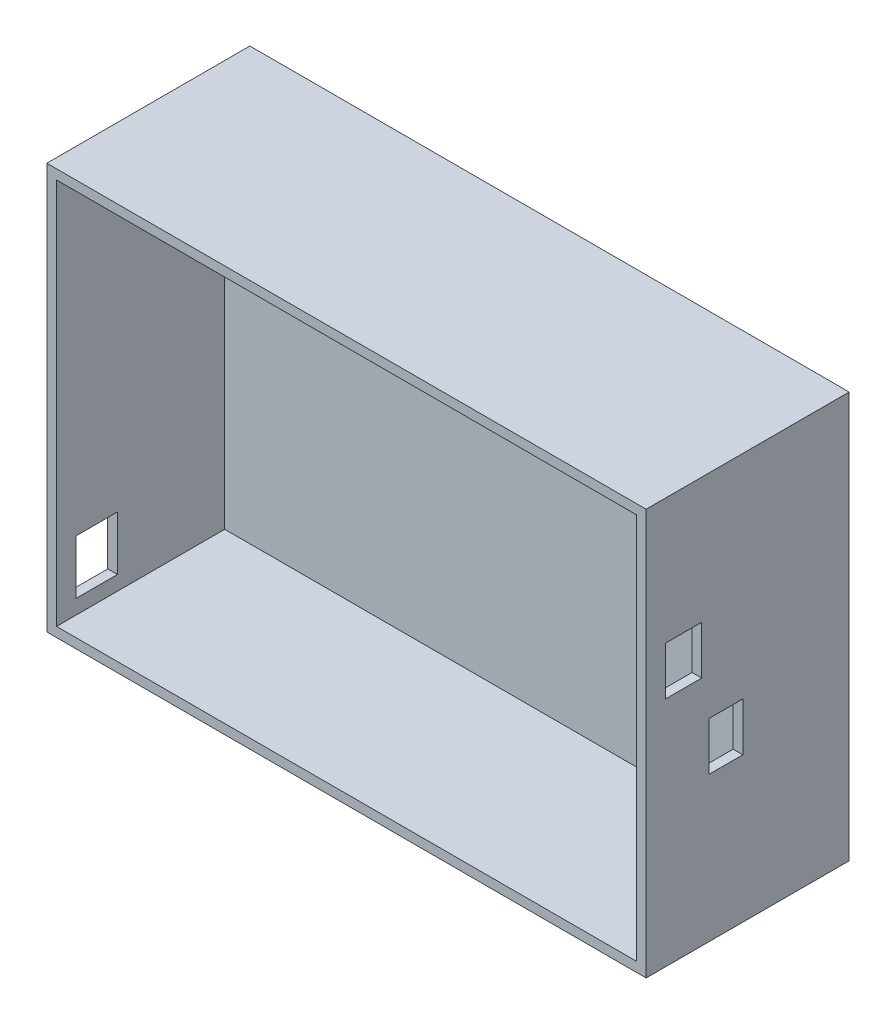
ISO-10303-21;
HEADER;
FILE_DESCRIPTION(('STEP AP214'),'2;1');
FILE_NAME('part.step','',(''),(''),'','','');
FILE_SCHEMA(('AUTOMOTIVE_DESIGN { 1 0 10303 214 1 1 1 1 }'));
ENDSEC;
DATA;
#1=APPLICATION_CONTEXT('core data for automotive mechanical design processes');
#2=APPLICATION_PROTOCOL_DEFINITION('international standard','automotive_design',2000,#1);
#3=PRODUCT_CONTEXT('',#1,'mechanical');
#4=PRODUCT('Part','Part','',(#3));
#5=PRODUCT_RELATED_PRODUCT_CATEGORY('part','',(#4));
#6=PRODUCT_DEFINITION_FORMATION('','',#4);
#7=PRODUCT_DEFINITION_CONTEXT('part definition',#1,'design');
#8=PRODUCT_DEFINITION('design','',#6,#7);
#9=PRODUCT_DEFINITION_SHAPE('','',#8);
#10=(LENGTH_UNIT() NAMED_UNIT(*) SI_UNIT(.MILLI.,.METRE.));
#11=(NAMED_UNIT(*) PLANE_ANGLE_UNIT() SI_UNIT($,.RADIAN.));
#12=(NAMED_UNIT(*) SI_UNIT($,.STERADIAN.) SOLID_ANGLE_UNIT());
#13=UNCERTAINTY_MEASURE_WITH_UNIT(LENGTH_MEASURE(1.E-05),#10,'distance_accuracy_value','');
#14=(GEOMETRIC_REPRESENTATION_CONTEXT(3) GLOBAL_UNCERTAINTY_ASSIGNED_CONTEXT((#13)) GLOBAL_UNIT_ASSIGNED_CONTEXT((#10,
#11,#12)) REPRESENTATION_CONTEXT('',''));
#15=CARTESIAN_POINT('',(0.,0.,0.));
#16=DIRECTION('',(0.,0.,1.));
#17=DIRECTION('',(1.,0.,0.));
#18=AXIS2_PLACEMENT_3D('',#15,#16,#17);
#19=CARTESIAN_POINT('',(78.74,-53.34,53.34));
#20=DIRECTION('',(-1.,0.,0.));
#21=DIRECTION('',(0.,0.,1.));
#22=AXIS2_PLACEMENT_3D('',#19,#20,#21);
#23=PLANE('',#22);
#24=DIRECTION('',(0.,0.,1.));
#25=VECTOR('',#24,1.);
#26=CARTESIAN_POINT('',(78.74,20.32,48.26));
#27=LINE('',#26,#25);
#28=CARTESIAN_POINT('',(78.74,20.32,38.735));
#29=VERTEX_POINT('',#28);
#30=CARTESIAN_POINT('',(78.74,20.32,48.26));
#31=VERTEX_POINT('',#30);
#32=EDGE_CURVE('E189',#29,#31,#27,.T.);
#33=ORIENTED_EDGE('',*,*,#32,.F.);
#34=DIRECTION('',(0.,1.,0.));
#35=VECTOR('',#34,1.);
#36=CARTESIAN_POINT('',(78.74,7.61999999999999,38.735));
#37=LINE('',#36,#35);
#38=CARTESIAN_POINT('',(78.74,7.61999999999999,38.735));
#39=VERTEX_POINT('',#38);
#40=EDGE_CURVE('E55',#39,#29,#37,.T.);
#41=ORIENTED_EDGE('',*,*,#40,.F.);
#42=DIRECTION('',(0.,0.,-1.));
#43=VECTOR('',#42,1.);
#44=CARTESIAN_POINT('',(78.74,7.61999999999999,48.26));
#45=LINE('',#44,#43);
#46=CARTESIAN_POINT('',(78.74,7.61999999999999,48.26));
#47=VERTEX_POINT('',#46);
#48=EDGE_CURVE('E195',#47,#39,#45,.T.);
#49=ORIENTED_EDGE('',*,*,#48,.F.);
#50=DIRECTION('',(0.,-1.,0.));
#51=VECTOR('',#50,1.);
#52=CARTESIAN_POINT('',(78.74,7.61999999999999,48.26));
#53=LINE('',#52,#51);
#54=EDGE_CURVE('E180',#31,#47,#53,.T.);
#55=ORIENTED_EDGE('',*,*,#54,.F.);
#56=EDGE_LOOP('',(#33,#41,#49,#55));
#57=FACE_BOUND('',#56,.T.);
#58=DIRECTION('',(0.,0.,1.));
#59=VECTOR('',#58,1.);
#60=CARTESIAN_POINT('',(78.74,-2.54,36.83));
#61=LINE('',#60,#59);
#62=CARTESIAN_POINT('',(78.74,-2.54000000000001,27.94));
#63=VERTEX_POINT('',#62);
#64=CARTESIAN_POINT('',(78.74,-2.54,36.83));
#65=VERTEX_POINT('',#64);
#66=EDGE_CURVE('E226',#63,#65,#61,.T.);
#67=ORIENTED_EDGE('',*,*,#66,.F.);
#68=DIRECTION('',(0.,1.,0.));
#69=VECTOR('',#68,1.);
#70=CARTESIAN_POINT('',(78.74,-15.24,27.94));
#71=LINE('',#70,#69);
#72=CARTESIAN_POINT('',(78.74,-15.24,27.94));
#73=VERTEX_POINT('',#72);
#74=EDGE_CURVE('E218',#73,#63,#71,.T.);
#75=ORIENTED_EDGE('',*,*,#74,.F.);
#76=DIRECTION('',(0.,0.,-1.));
#77=VECTOR('',#76,1.);
#78=CARTESIAN_POINT('',(78.74,-15.24,36.83));
#79=LINE('',#78,#77);
#80=CARTESIAN_POINT('',(78.74,-15.24,36.83));
#81=VERTEX_POINT('',#80);
#82=EDGE_CURVE('E232',#81,#73,#79,.T.);
#83=ORIENTED_EDGE('',*,*,#82,.F.);
#84=DIRECTION('',(0.,-1.,0.));
#85=VECTOR('',#84,1.);
#86=CARTESIAN_POINT('',(78.74,-15.24,36.83));
#87=LINE('',#86,#85);
#88=EDGE_CURVE('E229',#65,#81,#87,.T.);
#89=ORIENTED_EDGE('',*,*,#88,.F.);
#90=EDGE_LOOP('',(#67,#75,#83,#89));
#91=FACE_BOUND('',#90,.T.);
#92=DIRECTION('',(0.,1.,0.));
#93=VECTOR('',#92,1.);
#94=CARTESIAN_POINT('',(78.74,-53.34,0.));
#95=LINE('',#94,#93);
#96=CARTESIAN_POINT('',(78.74,-53.34,0.));
#97=VERTEX_POINT('',#96);
#98=CARTESIAN_POINT('',(78.74,53.34,0.));
#99=VERTEX_POINT('',#98);
#100=EDGE_CURVE('E270',#97,#99,#95,.T.);
#101=ORIENTED_EDGE('',*,*,#100,.T.);
#102=DIRECTION('',(0.,0.,-1.));
#103=VECTOR('',#102,1.);
#104=CARTESIAN_POINT('',(78.74,53.34,53.34));
#105=LINE('',#104,#103);
#106=CARTESIAN_POINT('',(78.74,53.34,53.34));
#107=VERTEX_POINT('',#106);
#108=EDGE_CURVE('E303',#107,#99,#105,.T.);
#109=ORIENTED_EDGE('',*,*,#108,.F.);
#110=DIRECTION('',(0.,1.,0.));
#111=VECTOR('',#110,1.);
#112=CARTESIAN_POINT('',(78.74,-53.34,53.34));
#113=LINE('',#112,#111);
#114=CARTESIAN_POINT('',(78.74,-53.34,53.34));
#115=VERTEX_POINT('',#114);
#116=EDGE_CURVE('E277',#115,#107,#113,.T.);
#117=ORIENTED_EDGE('',*,*,#116,.F.);
#118=DIRECTION('',(0.,0.,-1.));
#119=VECTOR('',#118,1.);
#120=CARTESIAN_POINT('',(78.74,-53.34,53.34));
#121=LINE('',#120,#119);
#122=EDGE_CURVE('E287',#115,#97,#121,.T.);
#123=ORIENTED_EDGE('',*,*,#122,.T.);
#124=EDGE_LOOP('',(#101,#109,#117,#123));
#125=FACE_BOUND('',#124,.T.);
#126=ADVANCED_FACE('F41',(#57,#91,#125),#23,.F.);
#127=CARTESIAN_POINT('',(-78.74,53.34,53.34));
#128=DIRECTION('',(0.,-1.,0.));
#129=DIRECTION('',(0.,0.,-1.));
#130=AXIS2_PLACEMENT_3D('',#127,#128,#129);
#131=PLANE('',#130);
#132=DIRECTION('',(-1.,0.,0.));
#133=VECTOR('',#132,1.);
#134=CARTESIAN_POINT('',(-78.74,53.34,0.));
#135=LINE('',#134,#133);
#136=CARTESIAN_POINT('',(-78.74,53.34,0.));
#137=VERTEX_POINT('',#136);
#138=EDGE_CURVE('E290',#99,#137,#135,.T.);
#139=ORIENTED_EDGE('',*,*,#138,.T.);
#140=DIRECTION('',(0.,0.,-1.));
#141=VECTOR('',#140,1.);
#142=CARTESIAN_POINT('',(-78.74,53.34,53.34));
#143=LINE('',#142,#141);
#144=CARTESIAN_POINT('',(-78.74,53.34,53.34));
#145=VERTEX_POINT('',#144);
#146=EDGE_CURVE('E300',#145,#137,#143,.T.);
#147=ORIENTED_EDGE('',*,*,#146,.F.);
#148=DIRECTION('',(-1.,0.,0.));
#149=VECTOR('',#148,1.);
#150=CARTESIAN_POINT('',(-78.74,53.34,53.34));
#151=LINE('',#150,#149);
#152=EDGE_CURVE('E280',#107,#145,#151,.T.);
#153=ORIENTED_EDGE('',*,*,#152,.F.);
#154=ORIENTED_EDGE('',*,*,#108,.T.);
#155=EDGE_LOOP('',(#139,#147,#153,#154));
#156=FACE_BOUND('',#155,.T.);
#157=ADVANCED_FACE('F354',(#156),#131,.F.);
#158=CARTESIAN_POINT('',(-78.74,-53.34,53.34));
#159=DIRECTION('',(1.,0.,0.));
#160=DIRECTION('',(0.,0.,-1.));
#161=AXIS2_PLACEMENT_3D('',#158,#159,#160);
#162=PLANE('',#161);
#163=DIRECTION('',(0.,0.,-1.));
#164=VECTOR('',#163,1.);
#165=CARTESIAN_POINT('',(-78.74,-32.766,37.338));
#166=LINE('',#165,#164);
#167=CARTESIAN_POINT('',(-78.74,-32.766,48.26));
#168=VERTEX_POINT('',#167);
#169=CARTESIAN_POINT('',(-78.74,-32.766,37.338));
#170=VERTEX_POINT('',#169);
#171=EDGE_CURVE('E206',#168,#170,#166,.T.);
#172=ORIENTED_EDGE('',*,*,#171,.F.);
#173=DIRECTION('',(0.,1.,0.));
#174=VECTOR('',#173,1.);
#175=CARTESIAN_POINT('',(-78.74,-32.766,48.26));
#176=LINE('',#175,#174);
#177=CARTESIAN_POINT('',(-78.74,-46.99,48.26));
#178=VERTEX_POINT('',#177);
#179=EDGE_CURVE('E202',#178,#168,#176,.T.);
#180=ORIENTED_EDGE('',*,*,#179,.F.);
#181=DIRECTION('',(0.,0.,1.));
#182=VECTOR('',#181,1.);
#183=CARTESIAN_POINT('',(-78.74,-46.99,37.338));
#184=LINE('',#183,#182);
#185=CARTESIAN_POINT('',(-78.74,-46.99,37.338));
#186=VERTEX_POINT('',#185);
#187=EDGE_CURVE('E212',#186,#178,#184,.T.);
#188=ORIENTED_EDGE('',*,*,#187,.F.);
#189=DIRECTION('',(0.,-1.,0.));
#190=VECTOR('',#189,1.);
#191=CARTESIAN_POINT('',(-78.74,-32.766,37.338));
#192=LINE('',#191,#190);
#193=EDGE_CURVE('E209',#170,#186,#192,.T.);
#194=ORIENTED_EDGE('',*,*,#193,.F.);
#195=EDGE_LOOP('',(#172,#180,#188,#194));
#196=FACE_BOUND('',#195,.T.);
#197=DIRECTION('',(0.,-1.,0.));
#198=VECTOR('',#197,1.);
#199=CARTESIAN_POINT('',(-78.74,-53.34,0.));
#200=LINE('',#199,#198);
#201=CARTESIAN_POINT('',(-78.74,-53.34,0.));
#202=VERTEX_POINT('',#201);
#203=EDGE_CURVE('E292',#137,#202,#200,.T.);
#204=ORIENTED_EDGE('',*,*,#203,.T.);
#205=DIRECTION('',(0.,0.,-1.));
#206=VECTOR('',#205,1.);
#207=CARTESIAN_POINT('',(-78.74,-53.34,53.34));
#208=LINE('',#207,#206);
#209=CARTESIAN_POINT('',(-78.74,-53.34,53.34));
#210=VERTEX_POINT('',#209);
#211=EDGE_CURVE('E297',#210,#202,#208,.T.);
#212=ORIENTED_EDGE('',*,*,#211,.F.);
#213=DIRECTION('',(0.,-1.,0.));
#214=VECTOR('',#213,1.);
#215=CARTESIAN_POINT('',(-78.74,-53.34,53.34));
#216=LINE('',#215,#214);
#217=EDGE_CURVE('E283',#145,#210,#216,.T.);
#218=ORIENTED_EDGE('',*,*,#217,.F.);
#219=ORIENTED_EDGE('',*,*,#146,.T.);
#220=EDGE_LOOP('',(#204,#212,#218,#219));
#221=FACE_BOUND('',#220,.T.);
#222=ADVANCED_FACE('F358',(#196,#221),#162,.F.);
#223=CARTESIAN_POINT('',(-78.74,-53.34,53.34));
#224=DIRECTION('',(0.,1.,0.));
#225=DIRECTION('',(0.,0.,1.));
#226=AXIS2_PLACEMENT_3D('',#223,#224,#225);
#227=PLANE('',#226);
#228=DIRECTION('',(1.,0.,0.));
#229=VECTOR('',#228,1.);
#230=CARTESIAN_POINT('',(-78.74,-53.34,0.));
#231=LINE('',#230,#229);
#232=EDGE_CURVE('E281',#202,#97,#231,.T.);
#233=ORIENTED_EDGE('',*,*,#232,.T.);
#234=ORIENTED_EDGE('',*,*,#122,.F.);
#235=DIRECTION('',(1.,0.,0.));
#236=VECTOR('',#235,1.);
#237=CARTESIAN_POINT('',(-78.74,-53.34,53.34));
#238=LINE('',#237,#236);
#239=EDGE_CURVE('E285',#210,#115,#238,.T.);
#240=ORIENTED_EDGE('',*,*,#239,.F.);
#241=ORIENTED_EDGE('',*,*,#211,.T.);
#242=EDGE_LOOP('',(#233,#234,#240,#241));
#243=FACE_BOUND('',#242,.T.);
#244=ADVANCED_FACE('F363',(#243),#227,.F.);
#245=CARTESIAN_POINT('',(0.,0.,53.34));
#246=DIRECTION('',(0.,0.,-1.));
#247=DIRECTION('',(-1.,0.,0.));
#248=AXIS2_PLACEMENT_3D('',#245,#246,#247);
#249=PLANE('',#248);
#250=DIRECTION('',(-1.,0.,0.));
#251=VECTOR('',#250,1.);
#252=CARTESIAN_POINT('',(-76.1999999999999,50.8,53.34));
#253=LINE('',#252,#251);
#254=CARTESIAN_POINT('',(76.2000000000001,50.8,53.34));
#255=VERTEX_POINT('',#254);
#256=CARTESIAN_POINT('',(-76.1999999999999,50.8,53.34));
#257=VERTEX_POINT('',#256);
#258=EDGE_CURVE('E260',#255,#257,#253,.T.);
#259=ORIENTED_EDGE('',*,*,#258,.F.);
#260=DIRECTION('',(0.,1.,0.));
#261=VECTOR('',#260,1.);
#262=CARTESIAN_POINT('',(76.2000000000001,-50.8,53.34));
#263=LINE('',#262,#261);
#264=CARTESIAN_POINT('',(76.2000000000001,-50.8,53.34));
#265=VERTEX_POINT('',#264);
#266=EDGE_CURVE('E238',#265,#255,#263,.T.);
#267=ORIENTED_EDGE('',*,*,#266,.F.);
#268=DIRECTION('',(1.,0.,0.));
#269=VECTOR('',#268,1.);
#270=CARTESIAN_POINT('',(-76.1999999999999,-50.8,53.34));
#271=LINE('',#270,#269);
#272=CARTESIAN_POINT('',(-76.1999999999999,-50.8,53.34));
#273=VERTEX_POINT('',#272);
#274=EDGE_CURVE('E249',#273,#265,#271,.T.);
#275=ORIENTED_EDGE('',*,*,#274,.F.);
#276=DIRECTION('',(0.,-1.,0.));
#277=VECTOR('',#276,1.);
#278=CARTESIAN_POINT('',(-76.1999999999999,-50.8,53.34));
#279=LINE('',#278,#277);
#280=EDGE_CURVE('E263',#257,#273,#279,.T.);
#281=ORIENTED_EDGE('',*,*,#280,.F.);
#282=EDGE_LOOP('',(#259,#267,#275,#281));
#283=FACE_BOUND('',#282,.T.);
#284=ORIENTED_EDGE('',*,*,#116,.T.);
#285=ORIENTED_EDGE('',*,*,#152,.T.);
#286=ORIENTED_EDGE('',*,*,#217,.T.);
#287=ORIENTED_EDGE('',*,*,#239,.T.);
#288=EDGE_LOOP('',(#284,#285,#286,#287));
#289=FACE_BOUND('',#288,.T.);
#290=ADVANCED_FACE('F369',(#283,#289),#249,.F.);
#291=CARTESIAN_POINT('',(0.,0.,0.));
#292=DIRECTION('',(0.,0.,-1.));
#293=DIRECTION('',(-1.,0.,0.));
#294=AXIS2_PLACEMENT_3D('',#291,#292,#293);
#295=PLANE('',#294);
#296=ORIENTED_EDGE('',*,*,#100,.F.);
#297=ORIENTED_EDGE('',*,*,#232,.F.);
#298=ORIENTED_EDGE('',*,*,#203,.F.);
#299=ORIENTED_EDGE('',*,*,#138,.F.);
#300=EDGE_LOOP('',(#296,#297,#298,#299));
#301=FACE_BOUND('',#300,.T.);
#302=ADVANCED_FACE('F371',(#301),#295,.T.);
#303=CARTESIAN_POINT('',(76.2000000000001,-50.8,9.144));
#304=DIRECTION('',(1.,0.,0.));
#305=DIRECTION('',(0.,0.,-1.));
#306=AXIS2_PLACEMENT_3D('',#303,#304,#305);
#307=PLANE('',#306);
#308=DIRECTION('',(0.,0.,-1.));
#309=VECTOR('',#308,1.);
#310=CARTESIAN_POINT('',(76.2000000000001,7.61999999999999,9.144));
#311=LINE('',#310,#309);
#312=CARTESIAN_POINT('',(76.2000000000001,7.61999999999999,48.26));
#313=VERTEX_POINT('',#312);
#314=CARTESIAN_POINT('',(76.2000000000001,7.61999999999999,38.735));
#315=VERTEX_POINT('',#314);
#316=EDGE_CURVE('E48',#313,#315,#311,.T.);
#317=ORIENTED_EDGE('',*,*,#316,.T.);
#318=DIRECTION('',(0.,1.,0.));
#319=VECTOR('',#318,1.);
#320=CARTESIAN_POINT('',(76.2000000000001,-50.8,38.735));
#321=LINE('',#320,#319);
#322=CARTESIAN_POINT('',(76.2000000000001,20.32,38.735));
#323=VERTEX_POINT('',#322);
#324=EDGE_CURVE('E11',#315,#323,#321,.T.);
#325=ORIENTED_EDGE('',*,*,#324,.T.);
#326=DIRECTION('',(0.,0.,1.));
#327=VECTOR('',#326,1.);
#328=CARTESIAN_POINT('',(76.2000000000001,20.32,9.14400000000002));
#329=LINE('',#328,#327);
#330=CARTESIAN_POINT('',(76.2000000000001,20.32,48.26));
#331=VERTEX_POINT('',#330);
#332=EDGE_CURVE('E330',#323,#331,#329,.T.);
#333=ORIENTED_EDGE('',*,*,#332,.T.);
#334=DIRECTION('',(0.,-1.,0.));
#335=VECTOR('',#334,1.);
#336=CARTESIAN_POINT('',(76.2000000000001,-50.8,48.26));
#337=LINE('',#336,#335);
#338=EDGE_CURVE('E183',#331,#313,#337,.T.);
#339=ORIENTED_EDGE('',*,*,#338,.T.);
#340=EDGE_LOOP('',(#317,#325,#333,#339));
#341=FACE_BOUND('',#340,.T.);
#342=DIRECTION('',(0.,0.,-1.));
#343=VECTOR('',#342,1.);
#344=CARTESIAN_POINT('',(76.2000000000001,-15.24,9.144));
#345=LINE('',#344,#343);
#346=CARTESIAN_POINT('',(76.2000000000001,-15.24,36.83));
#347=VERTEX_POINT('',#346);
#348=CARTESIAN_POINT('',(76.2000000000001,-15.24,27.94));
#349=VERTEX_POINT('',#348);
#350=EDGE_CURVE('E312',#347,#349,#345,.T.);
#351=ORIENTED_EDGE('',*,*,#350,.T.);
#352=DIRECTION('',(0.,1.,0.));
#353=VECTOR('',#352,1.);
#354=CARTESIAN_POINT('',(76.2000000000001,-50.8,27.94));
#355=LINE('',#354,#353);
#356=CARTESIAN_POINT('',(76.2000000000001,-2.54,27.94));
#357=VERTEX_POINT('',#356);
#358=EDGE_CURVE('E315',#349,#357,#355,.T.);
#359=ORIENTED_EDGE('',*,*,#358,.T.);
#360=DIRECTION('',(0.,0.,1.));
#361=VECTOR('',#360,1.);
#362=CARTESIAN_POINT('',(76.2000000000001,-2.54,9.144));
#363=LINE('',#362,#361);
#364=CARTESIAN_POINT('',(76.2000000000001,-2.54,36.83));
#365=VERTEX_POINT('',#364);
#366=EDGE_CURVE('E306',#357,#365,#363,.T.);
#367=ORIENTED_EDGE('',*,*,#366,.T.);
#368=DIRECTION('',(0.,-1.,0.));
#369=VECTOR('',#368,1.);
#370=CARTESIAN_POINT('',(76.2000000000001,-50.8,36.83));
#371=LINE('',#370,#369);
#372=EDGE_CURVE('E309',#365,#347,#371,.T.);
#373=ORIENTED_EDGE('',*,*,#372,.T.);
#374=EDGE_LOOP('',(#351,#359,#367,#373));
#375=FACE_BOUND('',#374,.T.);
#376=ORIENTED_EDGE('',*,*,#266,.T.);
#377=DIRECTION('',(0.,0.,1.));
#378=VECTOR('',#377,1.);
#379=CARTESIAN_POINT('',(76.2000000000001,50.8,9.144));
#380=LINE('',#379,#378);
#381=CARTESIAN_POINT('',(76.2000000000001,50.8,9.144));
#382=VERTEX_POINT('',#381);
#383=EDGE_CURVE('E258',#382,#255,#380,.T.);
#384=ORIENTED_EDGE('',*,*,#383,.F.);
#385=DIRECTION('',(0.,1.,0.));
#386=VECTOR('',#385,1.);
#387=CARTESIAN_POINT('',(76.2000000000001,-50.8,9.144));
#388=LINE('',#387,#386);
#389=CARTESIAN_POINT('',(76.2000000000001,-50.8,9.144));
#390=VERTEX_POINT('',#389);
#391=EDGE_CURVE('E245',#390,#382,#388,.T.);
#392=ORIENTED_EDGE('',*,*,#391,.F.);
#393=DIRECTION('',(0.,0.,1.));
#394=VECTOR('',#393,1.);
#395=CARTESIAN_POINT('',(76.2000000000001,-50.8,9.144));
#396=LINE('',#395,#394);
#397=EDGE_CURVE('E268',#390,#265,#396,.T.);
#398=ORIENTED_EDGE('',*,*,#397,.T.);
#399=EDGE_LOOP('',(#376,#384,#392,#398));
#400=FACE_BOUND('',#399,.T.);
#401=ADVANCED_FACE('F334',(#341,#375,#400),#307,.F.);
#402=CARTESIAN_POINT('',(-76.1999999999999,-50.8,9.144));
#403=DIRECTION('',(0.,-1.,0.));
#404=DIRECTION('',(0.,0.,-1.));
#405=AXIS2_PLACEMENT_3D('',#402,#403,#404);
#406=PLANE('',#405);
#407=ORIENTED_EDGE('',*,*,#274,.T.);
#408=ORIENTED_EDGE('',*,*,#397,.F.);
#409=DIRECTION('',(1.,0.,0.));
#410=VECTOR('',#409,1.);
#411=CARTESIAN_POINT('',(-76.1999999999999,-50.8,9.144));
#412=LINE('',#411,#410);
#413=CARTESIAN_POINT('',(-76.1999999999999,-50.8,9.144));
#414=VERTEX_POINT('',#413);
#415=EDGE_CURVE('E255',#414,#390,#412,.T.);
#416=ORIENTED_EDGE('',*,*,#415,.F.);
#417=DIRECTION('',(0.,0.,1.));
#418=VECTOR('',#417,1.);
#419=CARTESIAN_POINT('',(-76.1999999999999,-50.8,9.144));
#420=LINE('',#419,#418);
#421=EDGE_CURVE('E271',#414,#273,#420,.T.);
#422=ORIENTED_EDGE('',*,*,#421,.T.);
#423=EDGE_LOOP('',(#407,#408,#416,#422));
#424=FACE_BOUND('',#423,.T.);
#425=ADVANCED_FACE('F380',(#424),#406,.F.);
#426=CARTESIAN_POINT('',(-76.1999999999999,-50.8,9.144));
#427=DIRECTION('',(-1.,0.,0.));
#428=DIRECTION('',(0.,0.,1.));
#429=AXIS2_PLACEMENT_3D('',#426,#427,#428);
#430=PLANE('',#429);
#431=DIRECTION('',(0.,0.,1.));
#432=VECTOR('',#431,1.);
#433=CARTESIAN_POINT('',(-76.1999999999999,-46.99,9.144));
#434=LINE('',#433,#432);
#435=CARTESIAN_POINT('',(-76.1999999999999,-46.99,37.338));
#436=VERTEX_POINT('',#435);
#437=CARTESIAN_POINT('',(-76.1999999999999,-46.99,48.26));
#438=VERTEX_POINT('',#437);
#439=EDGE_CURVE('E324',#436,#438,#434,.T.);
#440=ORIENTED_EDGE('',*,*,#439,.T.);
#441=DIRECTION('',(0.,1.,0.));
#442=VECTOR('',#441,1.);
#443=CARTESIAN_POINT('',(-76.1999999999999,-50.8,48.26));
#444=LINE('',#443,#442);
#445=CARTESIAN_POINT('',(-76.1999999999999,-32.766,48.26));
#446=VERTEX_POINT('',#445);
#447=EDGE_CURVE('E327',#438,#446,#444,.T.);
#448=ORIENTED_EDGE('',*,*,#447,.T.);
#449=DIRECTION('',(0.,0.,-1.));
#450=VECTOR('',#449,1.);
#451=CARTESIAN_POINT('',(-76.1999999999999,-32.766,9.144));
#452=LINE('',#451,#450);
#453=CARTESIAN_POINT('',(-76.1999999999999,-32.766,37.338));
#454=VERTEX_POINT('',#453);
#455=EDGE_CURVE('E318',#446,#454,#452,.T.);
#456=ORIENTED_EDGE('',*,*,#455,.T.);
#457=DIRECTION('',(0.,-1.,0.));
#458=VECTOR('',#457,1.);
#459=CARTESIAN_POINT('',(-76.1999999999999,-50.8,37.338));
#460=LINE('',#459,#458);
#461=EDGE_CURVE('E321',#454,#436,#460,.T.);
#462=ORIENTED_EDGE('',*,*,#461,.T.);
#463=EDGE_LOOP('',(#440,#448,#456,#462));
#464=FACE_BOUND('',#463,.T.);
#465=ORIENTED_EDGE('',*,*,#280,.T.);
#466=ORIENTED_EDGE('',*,*,#421,.F.);
#467=DIRECTION('',(0.,-1.,0.));
#468=VECTOR('',#467,1.);
#469=CARTESIAN_POINT('',(-76.1999999999999,-50.8,9.144));
#470=LINE('',#469,#468);
#471=CARTESIAN_POINT('',(-76.1999999999999,50.8,9.144));
#472=VERTEX_POINT('',#471);
#473=EDGE_CURVE('E252',#472,#414,#470,.T.);
#474=ORIENTED_EDGE('',*,*,#473,.F.);
#475=DIRECTION('',(0.,0.,1.));
#476=VECTOR('',#475,1.);
#477=CARTESIAN_POINT('',(-76.1999999999999,50.8,9.144));
#478=LINE('',#477,#476);
#479=EDGE_CURVE('E273',#472,#257,#478,.T.);
#480=ORIENTED_EDGE('',*,*,#479,.T.);
#481=EDGE_LOOP('',(#465,#466,#474,#480));
#482=FACE_BOUND('',#481,.T.);
#483=ADVANCED_FACE('F385',(#464,#482),#430,.F.);
#484=CARTESIAN_POINT('',(-76.1999999999999,50.8,9.144));
#485=DIRECTION('',(0.,1.,0.));
#486=DIRECTION('',(0.,0.,1.));
#487=AXIS2_PLACEMENT_3D('',#484,#485,#486);
#488=PLANE('',#487);
#489=ORIENTED_EDGE('',*,*,#258,.T.);
#490=ORIENTED_EDGE('',*,*,#479,.F.);
#491=DIRECTION('',(-1.,0.,0.));
#492=VECTOR('',#491,1.);
#493=CARTESIAN_POINT('',(-76.1999999999999,50.8,9.144));
#494=LINE('',#493,#492);
#495=EDGE_CURVE('E248',#382,#472,#494,.T.);
#496=ORIENTED_EDGE('',*,*,#495,.F.);
#497=ORIENTED_EDGE('',*,*,#383,.T.);
#498=EDGE_LOOP('',(#489,#490,#496,#497));
#499=FACE_BOUND('',#498,.T.);
#500=ADVANCED_FACE('F381',(#499),#488,.F.);
#501=CARTESIAN_POINT('',(0.,0.,9.144));
#502=DIRECTION('',(0.,0.,-1.));
#503=DIRECTION('',(-1.,0.,0.));
#504=AXIS2_PLACEMENT_3D('',#501,#502,#503);
#505=PLANE('',#504);
#506=ORIENTED_EDGE('',*,*,#391,.T.);
#507=ORIENTED_EDGE('',*,*,#495,.T.);
#508=ORIENTED_EDGE('',*,*,#473,.T.);
#509=ORIENTED_EDGE('',*,*,#415,.T.);
#510=EDGE_LOOP('',(#506,#507,#508,#509));
#511=FACE_BOUND('',#510,.T.);
#512=ADVANCED_FACE('F384',(#511),#505,.F.);
#513=CARTESIAN_POINT('',(35.56,-15.24,27.94));
#514=DIRECTION('',(0.,0.,-1.));
#515=DIRECTION('',(-1.,0.,0.));
#516=AXIS2_PLACEMENT_3D('',#513,#514,#515);
#517=PLANE('',#516);
#518=DIRECTION('',(1.,0.,0.));
#519=VECTOR('',#518,1.);
#520=CARTESIAN_POINT('',(35.56,-15.24,27.94));
#521=LINE('',#520,#519);
#522=EDGE_CURVE('E236',#349,#73,#521,.T.);
#523=ORIENTED_EDGE('',*,*,#522,.T.);
#524=ORIENTED_EDGE('',*,*,#74,.T.);
#525=DIRECTION('',(1.,0.,0.));
#526=VECTOR('',#525,1.);
#527=CARTESIAN_POINT('',(35.56,-2.54,27.94));
#528=LINE('',#527,#526);
#529=EDGE_CURVE('E235',#357,#63,#528,.T.);
#530=ORIENTED_EDGE('',*,*,#529,.F.);
#531=ORIENTED_EDGE('',*,*,#358,.F.);
#532=EDGE_LOOP('',(#523,#524,#530,#531));
#533=FACE_BOUND('',#532,.T.);
#534=ADVANCED_FACE('F395',(#533),#517,.F.);
#535=CARTESIAN_POINT('',(35.56,-15.24,36.83));
#536=DIRECTION('',(0.,-1.,0.));
#537=DIRECTION('',(0.,0.,-1.));
#538=AXIS2_PLACEMENT_3D('',#535,#536,#537);
#539=PLANE('',#538);
#540=DIRECTION('',(1.,0.,0.));
#541=VECTOR('',#540,1.);
#542=CARTESIAN_POINT('',(35.56,-15.24,36.83));
#543=LINE('',#542,#541);
#544=EDGE_CURVE('E239',#347,#81,#543,.T.);
#545=ORIENTED_EDGE('',*,*,#544,.T.);
#546=ORIENTED_EDGE('',*,*,#82,.T.);
#547=ORIENTED_EDGE('',*,*,#522,.F.);
#548=ORIENTED_EDGE('',*,*,#350,.F.);
#549=EDGE_LOOP('',(#545,#546,#547,#548));
#550=FACE_BOUND('',#549,.T.);
#551=ADVANCED_FACE('F399',(#550),#539,.F.);
#552=CARTESIAN_POINT('',(35.56,-15.24,36.83));
#553=DIRECTION('',(0.,0.,1.));
#554=DIRECTION('',(1.,0.,0.));
#555=AXIS2_PLACEMENT_3D('',#552,#553,#554);
#556=PLANE('',#555);
#557=DIRECTION('',(1.,0.,0.));
#558=VECTOR('',#557,1.);
#559=CARTESIAN_POINT('',(35.56,-2.54,36.83));
#560=LINE('',#559,#558);
#561=EDGE_CURVE('E241',#365,#65,#560,.T.);
#562=ORIENTED_EDGE('',*,*,#561,.T.);
#563=ORIENTED_EDGE('',*,*,#88,.T.);
#564=ORIENTED_EDGE('',*,*,#544,.F.);
#565=ORIENTED_EDGE('',*,*,#372,.F.);
#566=EDGE_LOOP('',(#562,#563,#564,#565));
#567=FACE_BOUND('',#566,.T.);
#568=ADVANCED_FACE('F405',(#567),#556,.F.);
#569=CARTESIAN_POINT('',(35.56,-2.54,36.83));
#570=DIRECTION('',(0.,1.,0.));
#571=DIRECTION('',(0.,0.,1.));
#572=AXIS2_PLACEMENT_3D('',#569,#570,#571);
#573=PLANE('',#572);
#574=ORIENTED_EDGE('',*,*,#529,.T.);
#575=ORIENTED_EDGE('',*,*,#66,.T.);
#576=ORIENTED_EDGE('',*,*,#561,.F.);
#577=ORIENTED_EDGE('',*,*,#366,.F.);
#578=EDGE_LOOP('',(#574,#575,#576,#577));
#579=FACE_BOUND('',#578,.T.);
#580=ADVANCED_FACE('F401',(#579),#573,.F.);
#581=CARTESIAN_POINT('',(-35.56,-32.766,48.26));
#582=DIRECTION('',(0.,0.,1.));
#583=DIRECTION('',(1.,0.,0.));
#584=AXIS2_PLACEMENT_3D('',#581,#582,#583);
#585=PLANE('',#584);
#586=DIRECTION('',(-1.,0.,0.));
#587=VECTOR('',#586,1.);
#588=CARTESIAN_POINT('',(-35.56,-46.99,48.26));
#589=LINE('',#588,#587);
#590=EDGE_CURVE('E216',#438,#178,#589,.T.);
#591=ORIENTED_EDGE('',*,*,#590,.T.);
#592=ORIENTED_EDGE('',*,*,#179,.T.);
#593=DIRECTION('',(-1.,0.,0.));
#594=VECTOR('',#593,1.);
#595=CARTESIAN_POINT('',(-35.56,-32.766,48.26));
#596=LINE('',#595,#594);
#597=EDGE_CURVE('E215',#446,#168,#596,.T.);
#598=ORIENTED_EDGE('',*,*,#597,.F.);
#599=ORIENTED_EDGE('',*,*,#447,.F.);
#600=EDGE_LOOP('',(#591,#592,#598,#599));
#601=FACE_BOUND('',#600,.T.);
#602=ADVANCED_FACE('F404',(#601),#585,.F.);
#603=CARTESIAN_POINT('',(-35.56,-46.99,37.338));
#604=DIRECTION('',(0.,-1.,0.));
#605=DIRECTION('',(0.,0.,-1.));
#606=AXIS2_PLACEMENT_3D('',#603,#604,#605);
#607=PLANE('',#606);
#608=DIRECTION('',(-1.,0.,0.));
#609=VECTOR('',#608,1.);
#610=CARTESIAN_POINT('',(-35.56,-46.99,37.338));
#611=LINE('',#610,#609);
#612=EDGE_CURVE('E219',#436,#186,#611,.T.);
#613=ORIENTED_EDGE('',*,*,#612,.T.);
#614=ORIENTED_EDGE('',*,*,#187,.T.);
#615=ORIENTED_EDGE('',*,*,#590,.F.);
#616=ORIENTED_EDGE('',*,*,#439,.F.);
#617=EDGE_LOOP('',(#613,#614,#615,#616));
#618=FACE_BOUND('',#617,.T.);
#619=ADVANCED_FACE('F414',(#618),#607,.F.);
#620=CARTESIAN_POINT('',(-35.56,-32.766,37.338));
#621=DIRECTION('',(0.,0.,-1.));
#622=DIRECTION('',(-1.,0.,0.));
#623=AXIS2_PLACEMENT_3D('',#620,#621,#622);
#624=PLANE('',#623);
#625=DIRECTION('',(-1.,0.,0.));
#626=VECTOR('',#625,1.);
#627=CARTESIAN_POINT('',(-35.56,-32.766,37.338));
#628=LINE('',#627,#626);
#629=EDGE_CURVE('E221',#454,#170,#628,.T.);
#630=ORIENTED_EDGE('',*,*,#629,.T.);
#631=ORIENTED_EDGE('',*,*,#193,.T.);
#632=ORIENTED_EDGE('',*,*,#612,.F.);
#633=ORIENTED_EDGE('',*,*,#461,.F.);
#634=EDGE_LOOP('',(#630,#631,#632,#633));
#635=FACE_BOUND('',#634,.T.);
#636=ADVANCED_FACE('F348',(#635),#624,.F.);
#637=CARTESIAN_POINT('',(-35.56,-32.766,37.338));
#638=DIRECTION('',(0.,1.,0.));
#639=DIRECTION('',(0.,0.,1.));
#640=AXIS2_PLACEMENT_3D('',#637,#638,#639);
#641=PLANE('',#640);
#642=ORIENTED_EDGE('',*,*,#597,.T.);
#643=ORIENTED_EDGE('',*,*,#171,.T.);
#644=ORIENTED_EDGE('',*,*,#629,.F.);
#645=ORIENTED_EDGE('',*,*,#455,.F.);
#646=EDGE_LOOP('',(#642,#643,#644,#645));
#647=FACE_BOUND('',#646,.T.);
#648=ADVANCED_FACE('F341',(#647),#641,.F.);
#649=CARTESIAN_POINT('',(66.04,7.61999999999999,38.735));
#650=DIRECTION('',(0.,0.,-1.));
#651=DIRECTION('',(-1.,0.,0.));
#652=AXIS2_PLACEMENT_3D('',#649,#650,#651);
#653=PLANE('',#652);
#654=DIRECTION('',(1.,0.,0.));
#655=VECTOR('',#654,1.);
#656=CARTESIAN_POINT('',(66.04,7.61999999999999,38.735));
#657=LINE('',#656,#655);
#658=EDGE_CURVE('E200',#315,#39,#657,.T.);
#659=ORIENTED_EDGE('',*,*,#658,.T.);
#660=ORIENTED_EDGE('',*,*,#40,.T.);
#661=DIRECTION('',(1.,0.,0.));
#662=VECTOR('',#661,1.);
#663=CARTESIAN_POINT('',(66.04,20.32,38.735));
#664=LINE('',#663,#662);
#665=EDGE_CURVE('E186',#323,#29,#664,.T.);
#666=ORIENTED_EDGE('',*,*,#665,.F.);
#667=ORIENTED_EDGE('',*,*,#324,.F.);
#668=EDGE_LOOP('',(#659,#660,#666,#667));
#669=FACE_BOUND('',#668,.T.);
#670=ADVANCED_FACE('F339',(#669),#653,.F.);
#671=CARTESIAN_POINT('',(66.04,7.61999999999999,48.26));
#672=DIRECTION('',(0.,-1.,0.));
#673=DIRECTION('',(0.,0.,-1.));
#674=AXIS2_PLACEMENT_3D('',#671,#672,#673);
#675=PLANE('',#674);
#676=DIRECTION('',(1.,0.,0.));
#677=VECTOR('',#676,1.);
#678=CARTESIAN_POINT('',(66.04,7.61999999999999,48.26));
#679=LINE('',#678,#677);
#680=EDGE_CURVE('E185',#313,#47,#679,.T.);
#681=ORIENTED_EDGE('',*,*,#680,.T.);
#682=ORIENTED_EDGE('',*,*,#48,.T.);
#683=ORIENTED_EDGE('',*,*,#658,.F.);
#684=ORIENTED_EDGE('',*,*,#316,.F.);
#685=EDGE_LOOP('',(#681,#682,#683,#684));
#686=FACE_BOUND('',#685,.T.);
#687=ADVANCED_FACE('F338',(#686),#675,.F.);
#688=CARTESIAN_POINT('',(66.04,7.61999999999999,48.26));
#689=DIRECTION('',(0.,0.,1.));
#690=DIRECTION('',(1.,0.,0.));
#691=AXIS2_PLACEMENT_3D('',#688,#689,#690);
#692=PLANE('',#691);
#693=DIRECTION('',(1.,0.,0.));
#694=VECTOR('',#693,1.);
#695=CARTESIAN_POINT('',(66.04,20.32,48.26));
#696=LINE('',#695,#694);
#697=EDGE_CURVE('E63',#331,#31,#696,.T.);
#698=ORIENTED_EDGE('',*,*,#697,.T.);
#699=ORIENTED_EDGE('',*,*,#54,.T.);
#700=ORIENTED_EDGE('',*,*,#680,.F.);
#701=ORIENTED_EDGE('',*,*,#338,.F.);
#702=EDGE_LOOP('',(#698,#699,#700,#701));
#703=FACE_BOUND('',#702,.T.);
#704=ADVANCED_FACE('F177',(#703),#692,.F.);
#705=CARTESIAN_POINT('',(66.04,20.32,48.26));
#706=DIRECTION('',(0.,1.,0.));
#707=DIRECTION('',(0.,0.,1.));
#708=AXIS2_PLACEMENT_3D('',#705,#706,#707);
#709=PLANE('',#708);
#710=ORIENTED_EDGE('',*,*,#665,.T.);
#711=ORIENTED_EDGE('',*,*,#32,.T.);
#712=ORIENTED_EDGE('',*,*,#697,.F.);
#713=ORIENTED_EDGE('',*,*,#332,.F.);
#714=EDGE_LOOP('',(#710,#711,#712,#713));
#715=FACE_BOUND('',#714,.T.);
#716=ADVANCED_FACE('F190',(#715),#709,.F.);
#717=CLOSED_SHELL('',(#126,#157,#222,#244,#290,#302,#401,#425,#483,#500,#512,#534,#551,#568,
#580,#602,#619,#636,#648,#670,#687,#704,#716));
#718=MANIFOLD_SOLID_BREP('B2',#717);
#719=ADVANCED_BREP_SHAPE_REPRESENTATION('',(#18,#718),#14);
#720=SHAPE_DEFINITION_REPRESENTATION(#9,#719);
ENDSEC;
END-ISO-10303-21;
